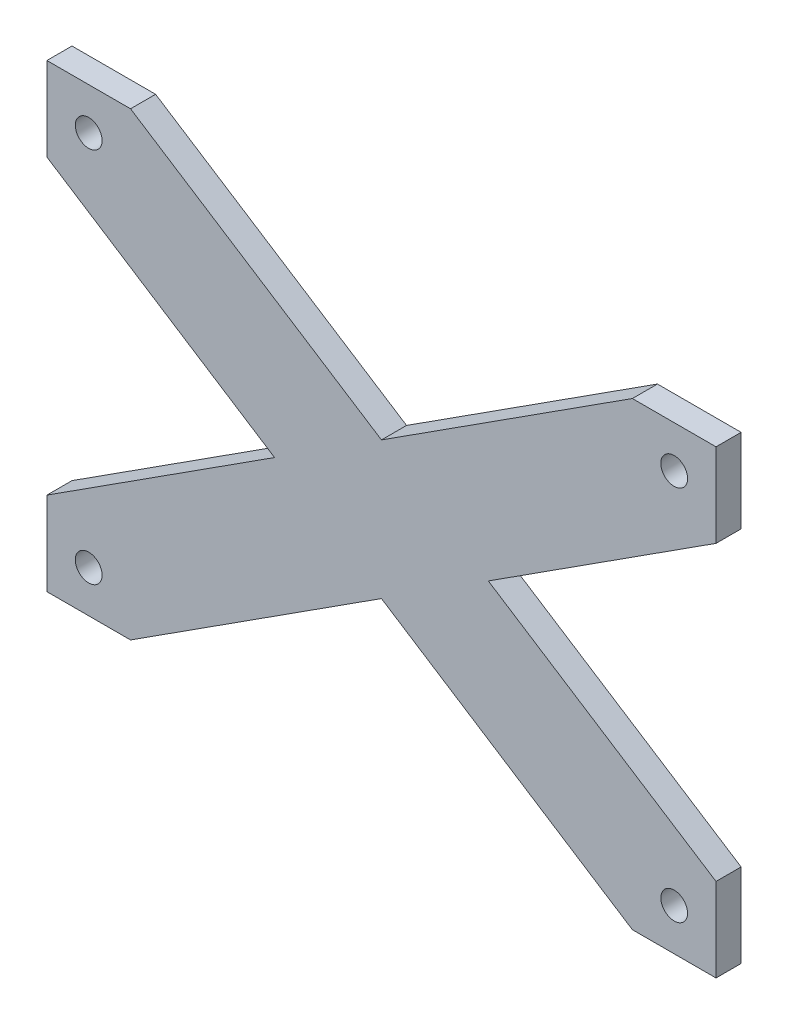
ISO-10303-21;
HEADER;
FILE_DESCRIPTION(('STEP AP214'),'2;1');
FILE_NAME('part.step','',(''),(''),'','','');
FILE_SCHEMA(('AUTOMOTIVE_DESIGN { 1 0 10303 214 1 1 1 1 }'));
ENDSEC;
DATA;
#1=APPLICATION_CONTEXT('core data for automotive mechanical design processes');
#2=APPLICATION_PROTOCOL_DEFINITION('international standard','automotive_design',2000,#1);
#3=PRODUCT_CONTEXT('',#1,'mechanical');
#4=PRODUCT('Part','Part','',(#3));
#5=PRODUCT_RELATED_PRODUCT_CATEGORY('part','',(#4));
#6=PRODUCT_DEFINITION_FORMATION('','',#4);
#7=PRODUCT_DEFINITION_CONTEXT('part definition',#1,'design');
#8=PRODUCT_DEFINITION('design','',#6,#7);
#9=PRODUCT_DEFINITION_SHAPE('','',#8);
#10=(LENGTH_UNIT() NAMED_UNIT(*) SI_UNIT(.MILLI.,.METRE.));
#11=(NAMED_UNIT(*) PLANE_ANGLE_UNIT() SI_UNIT($,.RADIAN.));
#12=(NAMED_UNIT(*) SI_UNIT($,.STERADIAN.) SOLID_ANGLE_UNIT());
#13=UNCERTAINTY_MEASURE_WITH_UNIT(LENGTH_MEASURE(1.E-05),#10,'distance_accuracy_value','');
#14=(GEOMETRIC_REPRESENTATION_CONTEXT(3) GLOBAL_UNCERTAINTY_ASSIGNED_CONTEXT((#13)) GLOBAL_UNIT_ASSIGNED_CONTEXT((#10,
#11,#12)) REPRESENTATION_CONTEXT('',''));
#15=CARTESIAN_POINT('',(0.,0.,0.));
#16=DIRECTION('',(0.,0.,1.));
#17=DIRECTION('',(1.,0.,0.));
#18=AXIS2_PLACEMENT_3D('',#15,#16,#17);
#19=CARTESIAN_POINT('',(40.,27.5,1.5));
#20=DIRECTION('',(-1.,0.,0.));
#21=DIRECTION('',(0.,-1.,0.));
#22=AXIS2_PLACEMENT_3D('',#19,#20,#21);
#23=PLANE('',#22);
#24=DIRECTION('',(0.,1.,0.));
#25=VECTOR('',#24,1.);
#26=CARTESIAN_POINT('',(40.,27.5,-1.5));
#27=LINE('',#26,#25);
#28=CARTESIAN_POINT('',(40.,-27.5,-1.5));
#29=VERTEX_POINT('',#28);
#30=CARTESIAN_POINT('',(40.,-17.5,-1.5));
#31=VERTEX_POINT('',#30);
#32=EDGE_CURVE('E275',#29,#31,#27,.T.);
#33=ORIENTED_EDGE('',*,*,#32,.T.);
#34=DIRECTION('',(0.,0.,1.));
#35=VECTOR('',#34,1.);
#36=CARTESIAN_POINT('',(40.,-17.5,-8.5));
#37=LINE('',#36,#35);
#38=CARTESIAN_POINT('',(40.,-17.5,1.5));
#39=VERTEX_POINT('',#38);
#40=EDGE_CURVE('E424',#31,#39,#37,.T.);
#41=ORIENTED_EDGE('',*,*,#40,.T.);
#42=DIRECTION('',(0.,1.,0.));
#43=VECTOR('',#42,1.);
#44=CARTESIAN_POINT('',(40.,27.5,1.5));
#45=LINE('',#44,#43);
#46=CARTESIAN_POINT('',(40.,-27.5,1.5));
#47=VERTEX_POINT('',#46);
#48=EDGE_CURVE('E248',#47,#39,#45,.T.);
#49=ORIENTED_EDGE('',*,*,#48,.F.);
#50=DIRECTION('',(0.,0.,-1.));
#51=VECTOR('',#50,1.);
#52=CARTESIAN_POINT('',(40.,-27.5,1.5));
#53=LINE('',#52,#51);
#54=EDGE_CURVE('E274',#47,#29,#53,.T.);
#55=ORIENTED_EDGE('',*,*,#54,.T.);
#56=EDGE_LOOP('',(#33,#41,#49,#55));
#57=FACE_BOUND('',#56,.T.);
#58=ADVANCED_FACE('F111',(#57),#23,.F.);
#59=CARTESIAN_POINT('',(-40.,27.5,1.5));
#60=DIRECTION('',(0.,-1.,0.));
#61=DIRECTION('',(0.,0.,-1.));
#62=AXIS2_PLACEMENT_3D('',#59,#60,#61);
#63=PLANE('',#62);
#64=DIRECTION('',(-1.,0.,0.));
#65=VECTOR('',#64,1.);
#66=CARTESIAN_POINT('',(-40.,27.5,1.5));
#67=LINE('',#66,#65);
#68=CARTESIAN_POINT('',(-30.,27.5,1.5));
#69=VERTEX_POINT('',#68);
#70=CARTESIAN_POINT('',(-40.,27.5,1.5));
#71=VERTEX_POINT('',#70);
#72=EDGE_CURVE('E253',#69,#71,#67,.T.);
#73=ORIENTED_EDGE('',*,*,#72,.F.);
#74=DIRECTION('',(0.,0.,1.));
#75=VECTOR('',#74,1.);
#76=CARTESIAN_POINT('',(-30.,27.5,-8.5));
#77=LINE('',#76,#75);
#78=CARTESIAN_POINT('',(-30.,27.5,-1.5));
#79=VERTEX_POINT('',#78);
#80=EDGE_CURVE('E377',#79,#69,#77,.T.);
#81=ORIENTED_EDGE('',*,*,#80,.F.);
#82=DIRECTION('',(-1.,0.,0.));
#83=VECTOR('',#82,1.);
#84=CARTESIAN_POINT('',(-40.,27.5,-1.5));
#85=LINE('',#84,#83);
#86=CARTESIAN_POINT('',(-40.,27.5,-1.5));
#87=VERTEX_POINT('',#86);
#88=EDGE_CURVE('E279',#79,#87,#85,.T.);
#89=ORIENTED_EDGE('',*,*,#88,.T.);
#90=DIRECTION('',(0.,0.,-1.));
#91=VECTOR('',#90,1.);
#92=CARTESIAN_POINT('',(-40.,27.5,1.5));
#93=LINE('',#92,#91);
#94=EDGE_CURVE('E297',#71,#87,#93,.T.);
#95=ORIENTED_EDGE('',*,*,#94,.F.);
#96=EDGE_LOOP('',(#73,#81,#89,#95));
#97=FACE_BOUND('',#96,.T.);
#98=ADVANCED_FACE('F458',(#97),#63,.F.);
#99=CARTESIAN_POINT('',(-40.,27.5,1.5));
#100=DIRECTION('',(1.,0.,0.));
#101=DIRECTION('',(0.,1.,0.));
#102=AXIS2_PLACEMENT_3D('',#99,#100,#101);
#103=PLANE('',#102);
#104=DIRECTION('',(0.,0.,1.));
#105=VECTOR('',#104,1.);
#106=CARTESIAN_POINT('',(-40.,17.5,-8.5));
#107=LINE('',#106,#105);
#108=CARTESIAN_POINT('',(-40.,17.5,-1.5));
#109=VERTEX_POINT('',#108);
#110=CARTESIAN_POINT('',(-40.,17.5,1.5));
#111=VERTEX_POINT('',#110);
#112=EDGE_CURVE('E394',#109,#111,#107,.T.);
#113=ORIENTED_EDGE('',*,*,#112,.T.);
#114=DIRECTION('',(0.,-1.,0.));
#115=VECTOR('',#114,1.);
#116=CARTESIAN_POINT('',(-40.,27.5,1.5));
#117=LINE('',#116,#115);
#118=EDGE_CURVE('E265',#71,#111,#117,.T.);
#119=ORIENTED_EDGE('',*,*,#118,.F.);
#120=ORIENTED_EDGE('',*,*,#94,.T.);
#121=DIRECTION('',(0.,-1.,0.));
#122=VECTOR('',#121,1.);
#123=CARTESIAN_POINT('',(-40.,27.5,-1.5));
#124=LINE('',#123,#122);
#125=EDGE_CURVE('E286',#87,#109,#124,.T.);
#126=ORIENTED_EDGE('',*,*,#125,.T.);
#127=EDGE_LOOP('',(#113,#119,#120,#126));
#128=FACE_BOUND('',#127,.T.);
#129=ADVANCED_FACE('F463',(#128),#103,.F.);
#130=CARTESIAN_POINT('',(-40.,-27.5,1.5));
#131=DIRECTION('',(0.,1.,0.));
#132=DIRECTION('',(0.,0.,1.));
#133=AXIS2_PLACEMENT_3D('',#130,#131,#132);
#134=PLANE('',#133);
#135=DIRECTION('',(0.,0.,1.));
#136=VECTOR('',#135,1.);
#137=CARTESIAN_POINT('',(30.,-27.5,-8.5));
#138=LINE('',#137,#136);
#139=CARTESIAN_POINT('',(30.,-27.5,-1.5));
#140=VERTEX_POINT('',#139);
#141=CARTESIAN_POINT('',(30.,-27.5,1.5));
#142=VERTEX_POINT('',#141);
#143=EDGE_CURVE('E409',#140,#142,#138,.T.);
#144=ORIENTED_EDGE('',*,*,#143,.F.);
#145=DIRECTION('',(1.,0.,0.));
#146=VECTOR('',#145,1.);
#147=CARTESIAN_POINT('',(-40.,-27.5,-1.5));
#148=LINE('',#147,#146);
#149=EDGE_CURVE('E255',#140,#29,#148,.T.);
#150=ORIENTED_EDGE('',*,*,#149,.T.);
#151=ORIENTED_EDGE('',*,*,#54,.F.);
#152=DIRECTION('',(1.,0.,0.));
#153=VECTOR('',#152,1.);
#154=CARTESIAN_POINT('',(-40.,-27.5,1.5));
#155=LINE('',#154,#153);
#156=EDGE_CURVE('E269',#142,#47,#155,.T.);
#157=ORIENTED_EDGE('',*,*,#156,.F.);
#158=EDGE_LOOP('',(#144,#150,#151,#157));
#159=FACE_BOUND('',#158,.T.);
#160=ADVANCED_FACE('F443',(#159),#134,.F.);
#161=CARTESIAN_POINT('',(0.,0.,1.5));
#162=DIRECTION('',(0.,0.,1.));
#163=DIRECTION('',(1.,0.,0.));
#164=AXIS2_PLACEMENT_3D('',#161,#162,#163);
#165=PLANE('',#164);
#166=CARTESIAN_POINT('',(-35.,-22.5,1.5));
#167=DIRECTION('',(0.,0.,1.));
#168=DIRECTION('',(-1.,0.,0.));
#169=AXIS2_PLACEMENT_3D('',#166,#167,#168);
#170=CIRCLE('',#169,1.6);
#171=CARTESIAN_POINT('',(-36.6,-22.5,1.5));
#172=VERTEX_POINT('',#171);
#173=EDGE_CURVE('E373',#172,#172,#170,.T.);
#174=ORIENTED_EDGE('',*,*,#173,.F.);
#175=EDGE_LOOP('',(#174));
#176=FACE_BOUND('',#175,.T.);
#177=CARTESIAN_POINT('',(35.,-22.5,1.5));
#178=DIRECTION('',(0.,0.,1.));
#179=DIRECTION('',(1.,0.,0.));
#180=AXIS2_PLACEMENT_3D('',#177,#178,#179);
#181=CIRCLE('',#180,1.6);
#182=CARTESIAN_POINT('',(36.6,-22.5,1.5));
#183=VERTEX_POINT('',#182);
#184=EDGE_CURVE('E365',#183,#183,#181,.T.);
#185=ORIENTED_EDGE('',*,*,#184,.F.);
#186=EDGE_LOOP('',(#185));
#187=FACE_BOUND('',#186,.T.);
#188=CARTESIAN_POINT('',(35.,22.5,1.5));
#189=DIRECTION('',(0.,0.,1.));
#190=DIRECTION('',(-1.,0.,0.));
#191=AXIS2_PLACEMENT_3D('',#188,#189,#190);
#192=CIRCLE('',#191,1.6);
#193=CARTESIAN_POINT('',(33.4,22.5,1.5));
#194=VERTEX_POINT('',#193);
#195=EDGE_CURVE('E357',#194,#194,#192,.T.);
#196=ORIENTED_EDGE('',*,*,#195,.F.);
#197=EDGE_LOOP('',(#196));
#198=FACE_BOUND('',#197,.T.);
#199=CARTESIAN_POINT('',(-35.,22.5,1.5));
#200=DIRECTION('',(0.,0.,1.));
#201=DIRECTION('',(1.,0.,0.));
#202=AXIS2_PLACEMENT_3D('',#199,#200,#201);
#203=CIRCLE('',#202,1.6);
#204=CARTESIAN_POINT('',(-33.4,22.5,1.5));
#205=VERTEX_POINT('',#204);
#206=EDGE_CURVE('E259',#205,#205,#203,.T.);
#207=ORIENTED_EDGE('',*,*,#206,.F.);
#208=EDGE_LOOP('',(#207));
#209=FACE_BOUND('',#208,.T.);
#210=DIRECTION('',(-0.841178475376554,-0.540757591313499,0.));
#211=VECTOR('',#210,1.);
#212=CARTESIAN_POINT('',(3.73646209386282,-5.81227436823105,1.5));
#213=LINE('',#212,#211);
#214=CARTESIAN_POINT('',(0.,-8.21428571428572,1.5));
#215=VERTEX_POINT('',#214);
#216=CARTESIAN_POINT('',(-30.,-27.5,1.5));
#217=VERTEX_POINT('',#216);
#218=EDGE_CURVE('E417',#215,#217,#213,.T.);
#219=ORIENTED_EDGE('',*,*,#218,.F.);
#220=DIRECTION('',(0.841178475376554,-0.540757591313499,0.));
#221=VECTOR('',#220,1.);
#222=CARTESIAN_POINT('',(-3.73646209386282,-5.81227436823105,1.5));
#223=LINE('',#222,#221);
#224=EDGE_CURVE('E420',#215,#142,#223,.T.);
#225=ORIENTED_EDGE('',*,*,#224,.T.);
#226=ORIENTED_EDGE('',*,*,#156,.T.);
#227=ORIENTED_EDGE('',*,*,#48,.T.);
#228=DIRECTION('',(0.841178475376554,-0.540757591313499,0.));
#229=VECTOR('',#228,1.);
#230=CARTESIAN_POINT('',(3.73646209386281,5.81227436823104,1.5));
#231=LINE('',#230,#229);
#232=CARTESIAN_POINT('',(12.7777777777778,0.,1.5));
#233=VERTEX_POINT('',#232);
#234=EDGE_CURVE('E233',#233,#39,#231,.T.);
#235=ORIENTED_EDGE('',*,*,#234,.F.);
#236=DIRECTION('',(-0.841178475376554,-0.540757591313499,0.));
#237=VECTOR('',#236,1.);
#238=CARTESIAN_POINT('',(3.73646209386282,-5.81227436823105,1.5));
#239=LINE('',#238,#237);
#240=CARTESIAN_POINT('',(40.,17.5,1.5));
#241=VERTEX_POINT('',#240);
#242=EDGE_CURVE('E225',#241,#233,#239,.T.);
#243=ORIENTED_EDGE('',*,*,#242,.F.);
#244=CARTESIAN_POINT('',(40.,27.5,1.5));
#245=VERTEX_POINT('',#244);
#246=EDGE_CURVE('E239',#241,#245,#45,.T.);
#247=ORIENTED_EDGE('',*,*,#246,.T.);
#248=CARTESIAN_POINT('',(30.,27.5,1.5));
#249=VERTEX_POINT('',#248);
#250=EDGE_CURVE('E261',#245,#249,#67,.T.);
#251=ORIENTED_EDGE('',*,*,#250,.T.);
#252=DIRECTION('',(0.841178475376554,0.540757591313499,0.));
#253=VECTOR('',#252,1.);
#254=CARTESIAN_POINT('',(-3.73646209386281,5.81227436823105,1.5));
#255=LINE('',#254,#253);
#256=CARTESIAN_POINT('',(0.,8.21428571428571,1.5));
#257=VERTEX_POINT('',#256);
#258=EDGE_CURVE('E387',#257,#249,#255,.T.);
#259=ORIENTED_EDGE('',*,*,#258,.F.);
#260=DIRECTION('',(0.841178475376554,-0.540757591313499,0.));
#261=VECTOR('',#260,1.);
#262=CARTESIAN_POINT('',(3.73646209386281,5.81227436823104,1.5));
#263=LINE('',#262,#261);
#264=EDGE_CURVE('E390',#69,#257,#263,.T.);
#265=ORIENTED_EDGE('',*,*,#264,.F.);
#266=ORIENTED_EDGE('',*,*,#72,.T.);
#267=ORIENTED_EDGE('',*,*,#118,.T.);
#268=DIRECTION('',(0.841178475376554,-0.540757591313499,0.));
#269=VECTOR('',#268,1.);
#270=CARTESIAN_POINT('',(-3.73646209386282,-5.81227436823105,1.5));
#271=LINE('',#270,#269);
#272=CARTESIAN_POINT('',(-12.7777777777778,0.,1.5));
#273=VERTEX_POINT('',#272);
#274=EDGE_CURVE('E402',#111,#273,#271,.T.);
#275=ORIENTED_EDGE('',*,*,#274,.T.);
#276=DIRECTION('',(0.841178475376554,0.540757591313499,0.));
#277=VECTOR('',#276,1.);
#278=CARTESIAN_POINT('',(-3.73646209386281,5.81227436823105,1.5));
#279=LINE('',#278,#277);
#280=CARTESIAN_POINT('',(-40.,-17.5,1.5));
#281=VERTEX_POINT('',#280);
#282=EDGE_CURVE('E406',#281,#273,#279,.T.);
#283=ORIENTED_EDGE('',*,*,#282,.F.);
#284=CARTESIAN_POINT('',(-40.,-27.5,1.5));
#285=VERTEX_POINT('',#284);
#286=EDGE_CURVE('E264',#281,#285,#117,.T.);
#287=ORIENTED_EDGE('',*,*,#286,.T.);
#288=EDGE_CURVE('E270',#285,#217,#155,.T.);
#289=ORIENTED_EDGE('',*,*,#288,.T.);
#290=EDGE_LOOP('',(#219,#225,#226,#227,#235,#243,#247,#251,#259,#265,#266,#267,#275,#283,#287,#289));
#291=FACE_BOUND('',#290,.T.);
#292=ADVANCED_FACE('F237',(#176,#187,#198,#209,#291),#165,.T.);
#293=CARTESIAN_POINT('',(0.,0.,-1.5));
#294=DIRECTION('',(0.,0.,1.));
#295=DIRECTION('',(1.,0.,0.));
#296=AXIS2_PLACEMENT_3D('',#293,#294,#295);
#297=PLANE('',#296);
#298=CARTESIAN_POINT('',(-35.,-22.5,-1.5));
#299=DIRECTION('',(0.,0.,1.));
#300=DIRECTION('',(-1.,0.,0.));
#301=AXIS2_PLACEMENT_3D('',#298,#299,#300);
#302=CIRCLE('',#301,1.6);
#303=CARTESIAN_POINT('',(-36.6,-22.5,-1.5));
#304=VERTEX_POINT('',#303);
#305=EDGE_CURVE('E369',#304,#304,#302,.T.);
#306=ORIENTED_EDGE('',*,*,#305,.T.);
#307=EDGE_LOOP('',(#306));
#308=FACE_BOUND('',#307,.T.);
#309=CARTESIAN_POINT('',(35.,-22.5,-1.5));
#310=DIRECTION('',(0.,0.,1.));
#311=DIRECTION('',(1.,0.,0.));
#312=AXIS2_PLACEMENT_3D('',#309,#310,#311);
#313=CIRCLE('',#312,1.6);
#314=CARTESIAN_POINT('',(36.6,-22.5,-1.5));
#315=VERTEX_POINT('',#314);
#316=EDGE_CURVE('E361',#315,#315,#313,.T.);
#317=ORIENTED_EDGE('',*,*,#316,.T.);
#318=EDGE_LOOP('',(#317));
#319=FACE_BOUND('',#318,.T.);
#320=CARTESIAN_POINT('',(35.,22.5,-1.5));
#321=DIRECTION('',(0.,0.,1.));
#322=DIRECTION('',(-1.,0.,0.));
#323=AXIS2_PLACEMENT_3D('',#320,#321,#322);
#324=CIRCLE('',#323,1.6);
#325=CARTESIAN_POINT('',(33.4,22.5,-1.5));
#326=VERTEX_POINT('',#325);
#327=EDGE_CURVE('E354',#326,#326,#324,.T.);
#328=ORIENTED_EDGE('',*,*,#327,.T.);
#329=EDGE_LOOP('',(#328));
#330=FACE_BOUND('',#329,.T.);
#331=CARTESIAN_POINT('',(-35.,22.5,-1.5));
#332=DIRECTION('',(0.,0.,1.));
#333=DIRECTION('',(1.,0.,0.));
#334=AXIS2_PLACEMENT_3D('',#331,#332,#333);
#335=CIRCLE('',#334,1.6);
#336=CARTESIAN_POINT('',(-33.4,22.5,-1.5));
#337=VERTEX_POINT('',#336);
#338=EDGE_CURVE('E349',#337,#337,#335,.T.);
#339=ORIENTED_EDGE('',*,*,#338,.T.);
#340=EDGE_LOOP('',(#339));
#341=FACE_BOUND('',#340,.T.);
#342=DIRECTION('',(0.841178475376554,-0.540757591313499,0.));
#343=VECTOR('',#342,1.);
#344=CARTESIAN_POINT('',(-3.73646209386282,-5.81227436823105,-1.5));
#345=LINE('',#344,#343);
#346=CARTESIAN_POINT('',(0.,-8.21428571428572,-1.5));
#347=VERTEX_POINT('',#346);
#348=EDGE_CURVE('E12',#347,#140,#345,.T.);
#349=ORIENTED_EDGE('',*,*,#348,.F.);
#350=DIRECTION('',(-0.841178475376554,-0.540757591313499,0.));
#351=VECTOR('',#350,1.);
#352=CARTESIAN_POINT('',(3.73646209386282,-5.81227436823105,-1.5));
#353=LINE('',#352,#351);
#354=CARTESIAN_POINT('',(-30.,-27.5,-1.5));
#355=VERTEX_POINT('',#354);
#356=EDGE_CURVE('E120',#347,#355,#353,.T.);
#357=ORIENTED_EDGE('',*,*,#356,.T.);
#358=CARTESIAN_POINT('',(-40.,-27.5,-1.5));
#359=VERTEX_POINT('',#358);
#360=EDGE_CURVE('E249',#359,#355,#148,.T.);
#361=ORIENTED_EDGE('',*,*,#360,.F.);
#362=CARTESIAN_POINT('',(-40.,-17.5,-1.5));
#363=VERTEX_POINT('',#362);
#364=EDGE_CURVE('E285',#363,#359,#124,.T.);
#365=ORIENTED_EDGE('',*,*,#364,.F.);
#366=DIRECTION('',(0.841178475376554,0.540757591313499,0.));
#367=VECTOR('',#366,1.);
#368=CARTESIAN_POINT('',(-3.73646209386281,5.81227436823105,-1.5));
#369=LINE('',#368,#367);
#370=CARTESIAN_POINT('',(-12.7777777777778,0.,-1.5));
#371=VERTEX_POINT('',#370);
#372=EDGE_CURVE('E317',#363,#371,#369,.T.);
#373=ORIENTED_EDGE('',*,*,#372,.T.);
#374=DIRECTION('',(0.841178475376554,-0.540757591313499,0.));
#375=VECTOR('',#374,1.);
#376=CARTESIAN_POINT('',(-3.73646209386282,-5.81227436823105,-1.5));
#377=LINE('',#376,#375);
#378=EDGE_CURVE('E321',#109,#371,#377,.T.);
#379=ORIENTED_EDGE('',*,*,#378,.F.);
#380=ORIENTED_EDGE('',*,*,#125,.F.);
#381=ORIENTED_EDGE('',*,*,#88,.F.);
#382=DIRECTION('',(0.841178475376554,-0.540757591313499,0.));
#383=VECTOR('',#382,1.);
#384=CARTESIAN_POINT('',(3.73646209386281,5.81227436823104,-1.5));
#385=LINE('',#384,#383);
#386=CARTESIAN_POINT('',(0.,8.21428571428571,-1.5));
#387=VERTEX_POINT('',#386);
#388=EDGE_CURVE('E307',#79,#387,#385,.T.);
#389=ORIENTED_EDGE('',*,*,#388,.T.);
#390=DIRECTION('',(0.841178475376554,0.540757591313499,0.));
#391=VECTOR('',#390,1.);
#392=CARTESIAN_POINT('',(-3.73646209386281,5.81227436823105,-1.5));
#393=LINE('',#392,#391);
#394=CARTESIAN_POINT('',(30.,27.5,-1.5));
#395=VERTEX_POINT('',#394);
#396=EDGE_CURVE('E303',#387,#395,#393,.T.);
#397=ORIENTED_EDGE('',*,*,#396,.T.);
#398=CARTESIAN_POINT('',(40.,27.5,-1.5));
#399=VERTEX_POINT('',#398);
#400=EDGE_CURVE('E281',#399,#395,#85,.T.);
#401=ORIENTED_EDGE('',*,*,#400,.F.);
#402=CARTESIAN_POINT('',(40.,17.5,-1.5));
#403=VERTEX_POINT('',#402);
#404=EDGE_CURVE('E280',#403,#399,#27,.T.);
#405=ORIENTED_EDGE('',*,*,#404,.F.);
#406=DIRECTION('',(-0.841178475376554,-0.540757591313499,0.));
#407=VECTOR('',#406,1.);
#408=CARTESIAN_POINT('',(3.73646209386282,-5.81227436823105,-1.5));
#409=LINE('',#408,#407);
#410=CARTESIAN_POINT('',(12.7777777777778,0.,-1.5));
#411=VERTEX_POINT('',#410);
#412=EDGE_CURVE('E228',#403,#411,#409,.T.);
#413=ORIENTED_EDGE('',*,*,#412,.T.);
#414=DIRECTION('',(0.841178475376554,-0.540757591313499,0.));
#415=VECTOR('',#414,1.);
#416=CARTESIAN_POINT('',(3.73646209386281,5.81227436823104,-1.5));
#417=LINE('',#416,#415);
#418=EDGE_CURVE('E313',#411,#31,#417,.T.);
#419=ORIENTED_EDGE('',*,*,#418,.T.);
#420=ORIENTED_EDGE('',*,*,#32,.F.);
#421=ORIENTED_EDGE('',*,*,#149,.F.);
#422=EDGE_LOOP('',(#349,#357,#361,#365,#373,#379,#380,#381,#389,#397,#401,#405,#413,#419,#420,#421));
#423=FACE_BOUND('',#422,.T.);
#424=ADVANCED_FACE('F328',(#308,#319,#330,#341,#423),#297,.F.);
#425=ORIENTED_EDGE('',*,*,#246,.F.);
#426=DIRECTION('',(0.,0.,1.));
#427=VECTOR('',#426,1.);
#428=CARTESIAN_POINT('',(40.,17.5,-8.5));
#429=LINE('',#428,#427);
#430=EDGE_CURVE('E222',#403,#241,#429,.T.);
#431=ORIENTED_EDGE('',*,*,#430,.F.);
#432=ORIENTED_EDGE('',*,*,#404,.T.);
#433=DIRECTION('',(0.,0.,-1.));
#434=VECTOR('',#433,1.);
#435=CARTESIAN_POINT('',(40.,27.5,1.5));
#436=LINE('',#435,#434);
#437=EDGE_CURVE('E246',#245,#399,#436,.T.);
#438=ORIENTED_EDGE('',*,*,#437,.F.);
#439=EDGE_LOOP('',(#425,#431,#432,#438));
#440=FACE_BOUND('',#439,.T.);
#441=ADVANCED_FACE('F113',(#440),#23,.F.);
#442=ORIENTED_EDGE('',*,*,#400,.T.);
#443=DIRECTION('',(0.,0.,1.));
#444=VECTOR('',#443,1.);
#445=CARTESIAN_POINT('',(30.,27.5,-8.5));
#446=LINE('',#445,#444);
#447=EDGE_CURVE('E380',#395,#249,#446,.T.);
#448=ORIENTED_EDGE('',*,*,#447,.T.);
#449=ORIENTED_EDGE('',*,*,#250,.F.);
#450=ORIENTED_EDGE('',*,*,#437,.T.);
#451=EDGE_LOOP('',(#442,#448,#449,#450));
#452=FACE_BOUND('',#451,.T.);
#453=ADVANCED_FACE('F446',(#452),#63,.F.);
#454=ORIENTED_EDGE('',*,*,#286,.F.);
#455=DIRECTION('',(0.,0.,1.));
#456=VECTOR('',#455,1.);
#457=CARTESIAN_POINT('',(-40.,-17.5,-8.5));
#458=LINE('',#457,#456);
#459=EDGE_CURVE('E343',#363,#281,#458,.T.);
#460=ORIENTED_EDGE('',*,*,#459,.F.);
#461=ORIENTED_EDGE('',*,*,#364,.T.);
#462=DIRECTION('',(0.,0.,-1.));
#463=VECTOR('',#462,1.);
#464=CARTESIAN_POINT('',(-40.,-27.5,1.5));
#465=LINE('',#464,#463);
#466=EDGE_CURVE('E293',#285,#359,#465,.T.);
#467=ORIENTED_EDGE('',*,*,#466,.F.);
#468=EDGE_LOOP('',(#454,#460,#461,#467));
#469=FACE_BOUND('',#468,.T.);
#470=ADVANCED_FACE('F341',(#469),#103,.F.);
#471=ORIENTED_EDGE('',*,*,#360,.T.);
#472=DIRECTION('',(0.,0.,1.));
#473=VECTOR('',#472,1.);
#474=CARTESIAN_POINT('',(-30.,-27.5,-8.5));
#475=LINE('',#474,#473);
#476=EDGE_CURVE('E337',#355,#217,#475,.T.);
#477=ORIENTED_EDGE('',*,*,#476,.T.);
#478=ORIENTED_EDGE('',*,*,#288,.F.);
#479=ORIENTED_EDGE('',*,*,#466,.T.);
#480=EDGE_LOOP('',(#471,#477,#478,#479));
#481=FACE_BOUND('',#480,.T.);
#482=ADVANCED_FACE('F335',(#481),#134,.F.);
#483=CARTESIAN_POINT('',(-35.,22.5,-1.5));
#484=DIRECTION('',(0.,0.,1.));
#485=DIRECTION('',(1.,0.,0.));
#486=AXIS2_PLACEMENT_3D('',#483,#484,#485);
#487=CYLINDRICAL_SURFACE('',#486,1.6);
#488=ORIENTED_EDGE('',*,*,#338,.F.);
#489=EDGE_LOOP('',(#488));
#490=FACE_BOUND('',#489,.T.);
#491=ORIENTED_EDGE('',*,*,#206,.T.);
#492=EDGE_LOOP('',(#491));
#493=FACE_BOUND('',#492,.T.);
#494=ADVANCED_FACE('F504',(#490,#493),#487,.F.);
#495=CARTESIAN_POINT('',(35.,22.5,-1.5));
#496=DIRECTION('',(0.,0.,1.));
#497=DIRECTION('',(1.,0.,0.));
#498=AXIS2_PLACEMENT_3D('',#495,#496,#497);
#499=CYLINDRICAL_SURFACE('',#498,1.6);
#500=ORIENTED_EDGE('',*,*,#327,.F.);
#501=EDGE_LOOP('',(#500));
#502=FACE_BOUND('',#501,.T.);
#503=ORIENTED_EDGE('',*,*,#195,.T.);
#504=EDGE_LOOP('',(#503));
#505=FACE_BOUND('',#504,.T.);
#506=ADVANCED_FACE('F608',(#502,#505),#499,.F.);
#507=CARTESIAN_POINT('',(35.,-22.5,-1.5));
#508=DIRECTION('',(0.,0.,1.));
#509=DIRECTION('',(1.,0.,0.));
#510=AXIS2_PLACEMENT_3D('',#507,#508,#509);
#511=CYLINDRICAL_SURFACE('',#510,1.6);
#512=ORIENTED_EDGE('',*,*,#316,.F.);
#513=EDGE_LOOP('',(#512));
#514=FACE_BOUND('',#513,.T.);
#515=ORIENTED_EDGE('',*,*,#184,.T.);
#516=EDGE_LOOP('',(#515));
#517=FACE_BOUND('',#516,.T.);
#518=ADVANCED_FACE('F611',(#514,#517),#511,.F.);
#519=CARTESIAN_POINT('',(-35.,-22.5,-1.5));
#520=DIRECTION('',(0.,0.,1.));
#521=DIRECTION('',(1.,0.,0.));
#522=AXIS2_PLACEMENT_3D('',#519,#520,#521);
#523=CYLINDRICAL_SURFACE('',#522,1.6);
#524=ORIENTED_EDGE('',*,*,#305,.F.);
#525=EDGE_LOOP('',(#524));
#526=FACE_BOUND('',#525,.T.);
#527=ORIENTED_EDGE('',*,*,#173,.T.);
#528=EDGE_LOOP('',(#527));
#529=FACE_BOUND('',#528,.T.);
#530=ADVANCED_FACE('F554',(#526,#529),#523,.F.);
#531=CARTESIAN_POINT('',(3.73646209386281,5.81227436823104,-8.5));
#532=DIRECTION('',(-0.540757591313499,-0.841178475376553,0.));
#533=DIRECTION('',(0.841178475376554,-0.540757591313499,0.));
#534=AXIS2_PLACEMENT_3D('',#531,#532,#533);
#535=PLANE('',#534);
#536=ORIENTED_EDGE('',*,*,#80,.T.);
#537=ORIENTED_EDGE('',*,*,#264,.T.);
#538=DIRECTION('',(0.,0.,1.));
#539=VECTOR('',#538,1.);
#540=CARTESIAN_POINT('',(0.,8.21428571428571,-8.5));
#541=LINE('',#540,#539);
#542=EDGE_CURVE('E384',#387,#257,#541,.T.);
#543=ORIENTED_EDGE('',*,*,#542,.F.);
#544=ORIENTED_EDGE('',*,*,#388,.F.);
#545=EDGE_LOOP('',(#536,#537,#543,#544));
#546=FACE_BOUND('',#545,.T.);
#547=ADVANCED_FACE('F454',(#546),#535,.F.);
#548=CARTESIAN_POINT('',(-3.73646209386281,5.81227436823105,-8.5));
#549=DIRECTION('',(0.540757591313499,-0.841178475376553,0.));
#550=DIRECTION('',(0.841178475376554,0.540757591313499,0.));
#551=AXIS2_PLACEMENT_3D('',#548,#549,#550);
#552=PLANE('',#551);
#553=ORIENTED_EDGE('',*,*,#542,.T.);
#554=ORIENTED_EDGE('',*,*,#258,.T.);
#555=ORIENTED_EDGE('',*,*,#447,.F.);
#556=ORIENTED_EDGE('',*,*,#396,.F.);
#557=EDGE_LOOP('',(#553,#554,#555,#556));
#558=FACE_BOUND('',#557,.T.);
#559=ADVANCED_FACE('F451',(#558),#552,.F.);
#560=CARTESIAN_POINT('',(3.73646209386281,5.81227436823104,-8.5));
#561=DIRECTION('',(-0.540757591313499,-0.841178475376553,0.));
#562=DIRECTION('',(0.841178475376554,-0.540757591313499,0.));
#563=AXIS2_PLACEMENT_3D('',#560,#561,#562);
#564=PLANE('',#563);
#565=DIRECTION('',(0.,0.,1.));
#566=VECTOR('',#565,1.);
#567=CARTESIAN_POINT('',(12.7777777777778,0.,-8.5));
#568=LINE('',#567,#566);
#569=EDGE_CURVE('E135',#411,#233,#568,.T.);
#570=ORIENTED_EDGE('',*,*,#569,.T.);
#571=ORIENTED_EDGE('',*,*,#234,.T.);
#572=ORIENTED_EDGE('',*,*,#40,.F.);
#573=ORIENTED_EDGE('',*,*,#418,.F.);
#574=EDGE_LOOP('',(#570,#571,#572,#573));
#575=FACE_BOUND('',#574,.T.);
#576=ADVANCED_FACE('F433',(#575),#564,.F.);
#577=CARTESIAN_POINT('',(3.73646209386282,-5.81227436823105,-8.5));
#578=DIRECTION('',(-0.540757591313499,0.841178475376553,0.));
#579=DIRECTION('',(-0.841178475376554,-0.540757591313499,0.));
#580=AXIS2_PLACEMENT_3D('',#577,#578,#579);
#581=PLANE('',#580);
#582=ORIENTED_EDGE('',*,*,#430,.T.);
#583=ORIENTED_EDGE('',*,*,#242,.T.);
#584=ORIENTED_EDGE('',*,*,#569,.F.);
#585=ORIENTED_EDGE('',*,*,#412,.F.);
#586=EDGE_LOOP('',(#582,#583,#584,#585));
#587=FACE_BOUND('',#586,.T.);
#588=ADVANCED_FACE('F224',(#587),#581,.F.);
#589=CARTESIAN_POINT('',(-3.73646209386282,-5.81227436823105,-8.5));
#590=DIRECTION('',(-0.540757591313499,-0.841178475376553,0.));
#591=DIRECTION('',(0.841178475376554,-0.540757591313499,0.));
#592=AXIS2_PLACEMENT_3D('',#589,#590,#591);
#593=PLANE('',#592);
#594=ORIENTED_EDGE('',*,*,#378,.T.);
#595=DIRECTION('',(0.,0.,1.));
#596=VECTOR('',#595,1.);
#597=CARTESIAN_POINT('',(-12.7777777777778,0.,-8.5));
#598=LINE('',#597,#596);
#599=EDGE_CURVE('E127',#371,#273,#598,.T.);
#600=ORIENTED_EDGE('',*,*,#599,.T.);
#601=ORIENTED_EDGE('',*,*,#274,.F.);
#602=ORIENTED_EDGE('',*,*,#112,.F.);
#603=EDGE_LOOP('',(#594,#600,#601,#602));
#604=FACE_BOUND('',#603,.T.);
#605=ADVANCED_FACE('F471',(#604),#593,.T.);
#606=CARTESIAN_POINT('',(-3.73646209386281,5.81227436823105,-8.5));
#607=DIRECTION('',(0.540757591313499,-0.841178475376553,0.));
#608=DIRECTION('',(0.841178475376554,0.540757591313499,0.));
#609=AXIS2_PLACEMENT_3D('',#606,#607,#608);
#610=PLANE('',#609);
#611=ORIENTED_EDGE('',*,*,#459,.T.);
#612=ORIENTED_EDGE('',*,*,#282,.T.);
#613=ORIENTED_EDGE('',*,*,#599,.F.);
#614=ORIENTED_EDGE('',*,*,#372,.F.);
#615=EDGE_LOOP('',(#611,#612,#613,#614));
#616=FACE_BOUND('',#615,.T.);
#617=ADVANCED_FACE('F468',(#616),#610,.F.);
#618=CARTESIAN_POINT('',(-3.73646209386282,-5.81227436823105,-8.5));
#619=DIRECTION('',(-0.540757591313499,-0.841178475376553,0.));
#620=DIRECTION('',(0.841178475376554,-0.540757591313499,0.));
#621=AXIS2_PLACEMENT_3D('',#618,#619,#620);
#622=PLANE('',#621);
#623=ORIENTED_EDGE('',*,*,#348,.T.);
#624=ORIENTED_EDGE('',*,*,#143,.T.);
#625=ORIENTED_EDGE('',*,*,#224,.F.);
#626=DIRECTION('',(0.,0.,1.));
#627=VECTOR('',#626,1.);
#628=CARTESIAN_POINT('',(0.,-8.21428571428572,-8.5));
#629=LINE('',#628,#627);
#630=EDGE_CURVE('E414',#347,#215,#629,.T.);
#631=ORIENTED_EDGE('',*,*,#630,.F.);
#632=EDGE_LOOP('',(#623,#624,#625,#631));
#633=FACE_BOUND('',#632,.T.);
#634=ADVANCED_FACE('F470',(#633),#622,.T.);
#635=CARTESIAN_POINT('',(3.73646209386282,-5.81227436823105,-8.5));
#636=DIRECTION('',(-0.540757591313499,0.841178475376553,0.));
#637=DIRECTION('',(-0.841178475376554,-0.540757591313499,0.));
#638=AXIS2_PLACEMENT_3D('',#635,#636,#637);
#639=PLANE('',#638);
#640=ORIENTED_EDGE('',*,*,#630,.T.);
#641=ORIENTED_EDGE('',*,*,#218,.T.);
#642=ORIENTED_EDGE('',*,*,#476,.F.);
#643=ORIENTED_EDGE('',*,*,#356,.F.);
#644=EDGE_LOOP('',(#640,#641,#642,#643));
#645=FACE_BOUND('',#644,.T.);
#646=ADVANCED_FACE('F477',(#645),#639,.F.);
#647=CLOSED_SHELL('',(#58,#98,#129,#160,#292,#424,#441,#453,#470,#482,#494,#506,#518,#530,#547,
#559,#576,#588,#605,#617,#634,#646));
#648=MANIFOLD_SOLID_BREP('B2',#647);
#649=ADVANCED_BREP_SHAPE_REPRESENTATION('',(#18,#648),#14);
#650=SHAPE_DEFINITION_REPRESENTATION(#9,#649);
ENDSEC;
END-ISO-10303-21;
